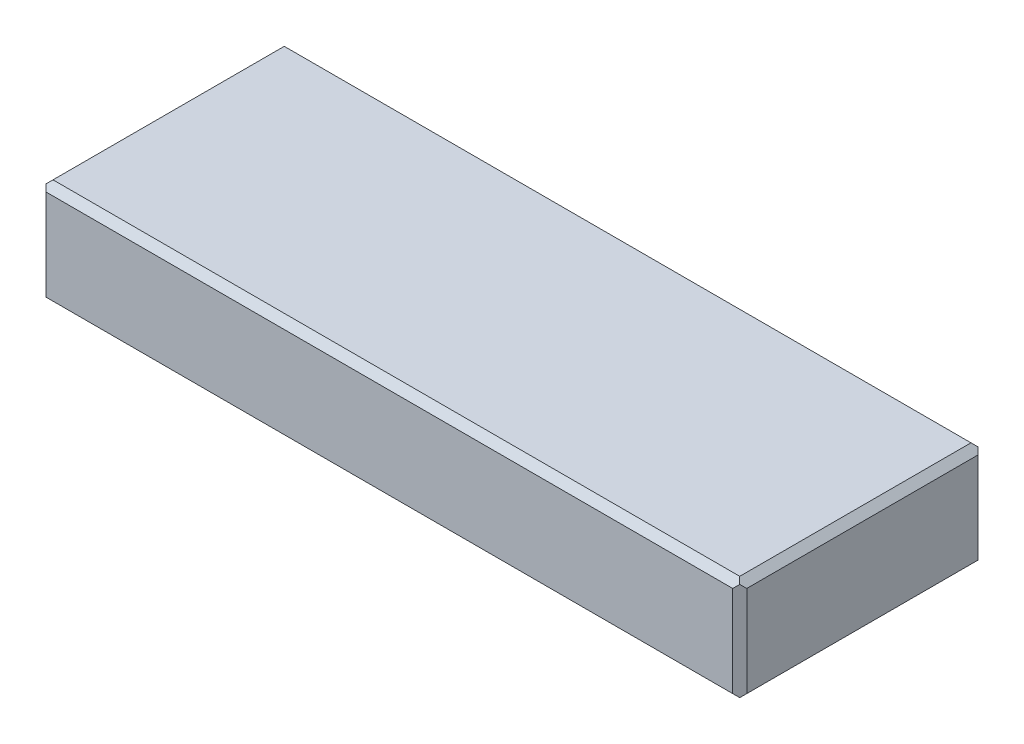
ISO-10303-21;
HEADER;
FILE_DESCRIPTION(('STEP AP214'),'2;1');
FILE_NAME('part.step','',(''),(''),'','','');
FILE_SCHEMA(('AUTOMOTIVE_DESIGN { 1 0 10303 214 1 1 1 1 }'));
ENDSEC;
DATA;
#1=APPLICATION_CONTEXT('core data for automotive mechanical design processes');
#2=APPLICATION_PROTOCOL_DEFINITION('international standard','automotive_design',2000,#1);
#3=PRODUCT_CONTEXT('',#1,'mechanical');
#4=PRODUCT('Part','Part','',(#3));
#5=PRODUCT_RELATED_PRODUCT_CATEGORY('part','',(#4));
#6=PRODUCT_DEFINITION_FORMATION('','',#4);
#7=PRODUCT_DEFINITION_CONTEXT('part definition',#1,'design');
#8=PRODUCT_DEFINITION('design','',#6,#7);
#9=PRODUCT_DEFINITION_SHAPE('','',#8);
#10=(LENGTH_UNIT() NAMED_UNIT(*) SI_UNIT(.MILLI.,.METRE.));
#11=(NAMED_UNIT(*) PLANE_ANGLE_UNIT() SI_UNIT($,.RADIAN.));
#12=(NAMED_UNIT(*) SI_UNIT($,.STERADIAN.) SOLID_ANGLE_UNIT());
#13=UNCERTAINTY_MEASURE_WITH_UNIT(LENGTH_MEASURE(1.E-05),#10,'distance_accuracy_value','');
#14=(GEOMETRIC_REPRESENTATION_CONTEXT(3) GLOBAL_UNCERTAINTY_ASSIGNED_CONTEXT((#13)) GLOBAL_UNIT_ASSIGNED_CONTEXT((#10,
#11,#12)) REPRESENTATION_CONTEXT('',''));
#15=CARTESIAN_POINT('',(0.,0.,0.));
#16=DIRECTION('',(0.,0.,1.));
#17=DIRECTION('',(1.,0.,0.));
#18=AXIS2_PLACEMENT_3D('',#15,#16,#17);
#19=CARTESIAN_POINT('',(-49.1218653149621,29.1510548523207,70.));
#20=DIRECTION('',(1.,0.,0.));
#21=DIRECTION('',(0.,1.,0.));
#22=AXIS2_PLACEMENT_3D('',#19,#20,#21);
#23=PLANE('',#22);
#24=DIRECTION('',(0.,0.,1.));
#25=VECTOR('',#24,1.);
#26=CARTESIAN_POINT('',(-49.1218653149621,1.15105485232071,70.));
#27=LINE('',#26,#25);
#28=CARTESIAN_POINT('',(-49.1218653149621,1.15105485232071,2.00000000000003));
#29=VERTEX_POINT('',#28);
#30=CARTESIAN_POINT('',(-49.1218653149621,1.15105485232071,68.));
#31=VERTEX_POINT('',#30);
#32=EDGE_CURVE('E172',#29,#31,#27,.T.);
#33=ORIENTED_EDGE('',*,*,#32,.T.);
#34=DIRECTION('',(0.,1.,0.));
#35=VECTOR('',#34,1.);
#36=CARTESIAN_POINT('',(-49.1218653149621,27.1510548523207,68.));
#37=LINE('',#36,#35);
#38=CARTESIAN_POINT('',(-49.1218653149621,27.1510548523207,68.));
#39=VERTEX_POINT('',#38);
#40=EDGE_CURVE('E235',#31,#39,#37,.T.);
#41=ORIENTED_EDGE('',*,*,#40,.T.);
#42=DIRECTION('',(0.,0.,-1.));
#43=VECTOR('',#42,1.);
#44=CARTESIAN_POINT('',(-49.1218653149621,27.1510548523207,70.));
#45=LINE('',#44,#43);
#46=CARTESIAN_POINT('',(-49.1218653149621,27.1510548523207,2.));
#47=VERTEX_POINT('',#46);
#48=EDGE_CURVE('E183',#39,#47,#45,.T.);
#49=ORIENTED_EDGE('',*,*,#48,.T.);
#50=DIRECTION('',(0.,-1.,0.));
#51=VECTOR('',#50,1.);
#52=CARTESIAN_POINT('',(-49.1218653149621,29.1510548523207,2.));
#53=LINE('',#52,#51);
#54=EDGE_CURVE('E232',#47,#29,#53,.T.);
#55=ORIENTED_EDGE('',*,*,#54,.T.);
#56=EDGE_LOOP('',(#33,#41,#49,#55));
#57=FACE_BOUND('',#56,.T.);
#58=ADVANCED_FACE('F31',(#57),#23,.F.);
#59=CARTESIAN_POINT('',(-49.1218653149621,-0.848945147679317,70.));
#60=DIRECTION('',(0.,1.,0.));
#61=DIRECTION('',(0.,0.,1.));
#62=AXIS2_PLACEMENT_3D('',#59,#60,#61);
#63=PLANE('',#62);
#64=DIRECTION('',(-1.,0.,0.));
#65=VECTOR('',#64,1.);
#66=CARTESIAN_POINT('',(-49.1218653149621,-0.848945147679317,68.));
#67=LINE('',#66,#65);
#68=CARTESIAN_POINT('',(148.878134685038,-0.848945147679317,68.));
#69=VERTEX_POINT('',#68);
#70=CARTESIAN_POINT('',(-47.1218653149621,-0.848945147679317,68.));
#71=VERTEX_POINT('',#70);
#72=EDGE_CURVE('E161',#69,#71,#67,.T.);
#73=ORIENTED_EDGE('',*,*,#72,.T.);
#74=DIRECTION('',(0.,0.,-1.));
#75=VECTOR('',#74,1.);
#76=CARTESIAN_POINT('',(-47.1218653149621,-0.848945147679317,70.));
#77=LINE('',#76,#75);
#78=CARTESIAN_POINT('',(-47.1218653149621,-0.848945147679317,2.00000000000003));
#79=VERTEX_POINT('',#78);
#80=EDGE_CURVE('E160',#71,#79,#77,.T.);
#81=ORIENTED_EDGE('',*,*,#80,.T.);
#82=DIRECTION('',(1.,0.,0.));
#83=VECTOR('',#82,1.);
#84=CARTESIAN_POINT('',(-49.1218653149621,-0.848945147679317,2.00000000000003));
#85=LINE('',#84,#83);
#86=CARTESIAN_POINT('',(148.878134685038,-0.848945147679317,2.00000000000003));
#87=VERTEX_POINT('',#86);
#88=EDGE_CURVE('E146',#79,#87,#85,.T.);
#89=ORIENTED_EDGE('',*,*,#88,.T.);
#90=DIRECTION('',(0.,0.,1.));
#91=VECTOR('',#90,1.);
#92=CARTESIAN_POINT('',(148.878134685038,-0.848945147679317,70.));
#93=LINE('',#92,#91);
#94=EDGE_CURVE('E157',#87,#69,#93,.T.);
#95=ORIENTED_EDGE('',*,*,#94,.T.);
#96=EDGE_LOOP('',(#73,#81,#89,#95));
#97=FACE_BOUND('',#96,.T.);
#98=ADVANCED_FACE('F156',(#97),#63,.F.);
#99=CARTESIAN_POINT('',(150.878134685038,29.1510548523207,70.));
#100=DIRECTION('',(-1.,0.,0.));
#101=DIRECTION('',(0.,0.,1.));
#102=AXIS2_PLACEMENT_3D('',#99,#100,#101);
#103=PLANE('',#102);
#104=DIRECTION('',(0.,0.,1.));
#105=VECTOR('',#104,1.);
#106=CARTESIAN_POINT('',(150.878134685038,27.1510548523207,70.));
#107=LINE('',#106,#105);
#108=CARTESIAN_POINT('',(150.878134685038,27.1510548523207,1.99999999999999));
#109=VERTEX_POINT('',#108);
#110=CARTESIAN_POINT('',(150.878134685038,27.1510548523207,68.));
#111=VERTEX_POINT('',#110);
#112=EDGE_CURVE('E204',#109,#111,#107,.T.);
#113=ORIENTED_EDGE('',*,*,#112,.T.);
#114=DIRECTION('',(0.,-1.,0.));
#115=VECTOR('',#114,1.);
#116=CARTESIAN_POINT('',(150.878134685038,1.15105485232071,68.));
#117=LINE('',#116,#115);
#118=CARTESIAN_POINT('',(150.878134685038,1.15105485232072,68.));
#119=VERTEX_POINT('',#118);
#120=EDGE_CURVE('E252',#111,#119,#117,.T.);
#121=ORIENTED_EDGE('',*,*,#120,.T.);
#122=DIRECTION('',(0.,0.,-1.));
#123=VECTOR('',#122,1.);
#124=CARTESIAN_POINT('',(150.878134685038,1.15105485232071,70.));
#125=LINE('',#124,#123);
#126=CARTESIAN_POINT('',(150.878134685038,1.15105485232071,2.));
#127=VERTEX_POINT('',#126);
#128=EDGE_CURVE('E180',#119,#127,#125,.T.);
#129=ORIENTED_EDGE('',*,*,#128,.T.);
#130=DIRECTION('',(0.,1.,0.));
#131=VECTOR('',#130,1.);
#132=CARTESIAN_POINT('',(150.878134685038,29.1510548523207,2.));
#133=LINE('',#132,#131);
#134=EDGE_CURVE('E249',#127,#109,#133,.T.);
#135=ORIENTED_EDGE('',*,*,#134,.T.);
#136=EDGE_LOOP('',(#113,#121,#129,#135));
#137=FACE_BOUND('',#136,.T.);
#138=ADVANCED_FACE('F305',(#137),#103,.F.);
#139=CARTESIAN_POINT('',(-49.1218653149621,29.1510548523207,70.));
#140=DIRECTION('',(0.,-1.,0.));
#141=DIRECTION('',(0.,0.,-1.));
#142=AXIS2_PLACEMENT_3D('',#139,#140,#141);
#143=PLANE('',#142);
#144=DIRECTION('',(-1.,0.,0.));
#145=VECTOR('',#144,1.);
#146=CARTESIAN_POINT('',(-49.1218653149621,29.1510548523207,2.));
#147=LINE('',#146,#145);
#148=CARTESIAN_POINT('',(148.878134685038,29.1510548523207,2.));
#149=VERTEX_POINT('',#148);
#150=CARTESIAN_POINT('',(-47.1218653149621,29.1510548523207,2.));
#151=VERTEX_POINT('',#150);
#152=EDGE_CURVE('E191',#149,#151,#147,.T.);
#153=ORIENTED_EDGE('',*,*,#152,.T.);
#154=DIRECTION('',(0.,0.,1.));
#155=VECTOR('',#154,1.);
#156=CARTESIAN_POINT('',(-47.1218653149621,29.1510548523207,70.));
#157=LINE('',#156,#155);
#158=CARTESIAN_POINT('',(-47.1218653149621,29.1510548523207,68.));
#159=VERTEX_POINT('',#158);
#160=EDGE_CURVE('E198',#151,#159,#157,.T.);
#161=ORIENTED_EDGE('',*,*,#160,.T.);
#162=DIRECTION('',(1.,0.,0.));
#163=VECTOR('',#162,1.);
#164=CARTESIAN_POINT('',(150.878134685038,29.1510548523207,68.));
#165=LINE('',#164,#163);
#166=CARTESIAN_POINT('',(148.878134685038,29.1510548523207,68.));
#167=VERTEX_POINT('',#166);
#168=EDGE_CURVE('E195',#159,#167,#165,.T.);
#169=ORIENTED_EDGE('',*,*,#168,.T.);
#170=DIRECTION('',(0.,0.,-1.));
#171=VECTOR('',#170,1.);
#172=CARTESIAN_POINT('',(148.878134685038,29.1510548523207,70.));
#173=LINE('',#172,#171);
#174=EDGE_CURVE('E193',#167,#149,#173,.T.);
#175=ORIENTED_EDGE('',*,*,#174,.T.);
#176=EDGE_LOOP('',(#153,#161,#169,#175));
#177=FACE_BOUND('',#176,.T.);
#178=ADVANCED_FACE('F296',(#177),#143,.F.);
#179=CARTESIAN_POINT('',(-49.1218653149621,-0.848945147679317,70.));
#180=DIRECTION('',(0.,0.,1.));
#181=DIRECTION('',(1.,0.,0.));
#182=AXIS2_PLACEMENT_3D('',#179,#180,#181);
#183=PLANE('',#182);
#184=DIRECTION('',(-1.,0.,0.));
#185=VECTOR('',#184,1.);
#186=CARTESIAN_POINT('',(-49.1218653149621,27.1510548523207,70.));
#187=LINE('',#186,#185);
#188=CARTESIAN_POINT('',(148.878134685038,27.1510548523207,70.));
#189=VERTEX_POINT('',#188);
#190=CARTESIAN_POINT('',(-47.1218653149621,27.1510548523207,70.));
#191=VERTEX_POINT('',#190);
#192=EDGE_CURVE('E201',#189,#191,#187,.T.);
#193=ORIENTED_EDGE('',*,*,#192,.T.);
#194=DIRECTION('',(0.,-1.,0.));
#195=VECTOR('',#194,1.);
#196=CARTESIAN_POINT('',(-47.1218653149621,1.15105485232071,70.));
#197=LINE('',#196,#195);
#198=CARTESIAN_POINT('',(-47.1218653149621,1.15105485232072,70.));
#199=VERTEX_POINT('',#198);
#200=EDGE_CURVE('E221',#191,#199,#197,.T.);
#201=ORIENTED_EDGE('',*,*,#200,.T.);
#202=DIRECTION('',(1.,0.,0.));
#203=VECTOR('',#202,1.);
#204=CARTESIAN_POINT('',(150.878134685038,1.15105485232071,70.));
#205=LINE('',#204,#203);
#206=CARTESIAN_POINT('',(148.878134685038,1.15105485232073,70.));
#207=VERTEX_POINT('',#206);
#208=EDGE_CURVE('E177',#199,#207,#205,.T.);
#209=ORIENTED_EDGE('',*,*,#208,.T.);
#210=DIRECTION('',(0.,1.,0.));
#211=VECTOR('',#210,1.);
#212=CARTESIAN_POINT('',(148.878134685038,27.1510548523207,70.));
#213=LINE('',#212,#211);
#214=EDGE_CURVE('E209',#207,#189,#213,.T.);
#215=ORIENTED_EDGE('',*,*,#214,.T.);
#216=EDGE_LOOP('',(#193,#201,#209,#215));
#217=FACE_BOUND('',#216,.T.);
#218=ADVANCED_FACE('F339',(#217),#183,.T.);
#219=CARTESIAN_POINT('',(-49.1218653149621,-0.848945147679317,0.));
#220=DIRECTION('',(0.,0.,1.));
#221=DIRECTION('',(1.,0.,0.));
#222=AXIS2_PLACEMENT_3D('',#219,#220,#221);
#223=PLANE('',#222);
#224=DIRECTION('',(1.,0.,0.));
#225=VECTOR('',#224,1.);
#226=CARTESIAN_POINT('',(-49.1218653149621,27.1510548523207,0.));
#227=LINE('',#226,#225);
#228=CARTESIAN_POINT('',(-47.1218653149621,27.1510548523207,0.));
#229=VERTEX_POINT('',#228);
#230=CARTESIAN_POINT('',(148.878134685038,27.1510548523207,0.));
#231=VERTEX_POINT('',#230);
#232=EDGE_CURVE('E207',#229,#231,#227,.T.);
#233=ORIENTED_EDGE('',*,*,#232,.T.);
#234=DIRECTION('',(0.,-1.,0.));
#235=VECTOR('',#234,1.);
#236=CARTESIAN_POINT('',(148.878134685038,-0.848945147679317,0.));
#237=LINE('',#236,#235);
#238=CARTESIAN_POINT('',(148.878134685038,1.15105485232071,0.));
#239=VERTEX_POINT('',#238);
#240=EDGE_CURVE('E52',#231,#239,#237,.T.);
#241=ORIENTED_EDGE('',*,*,#240,.T.);
#242=DIRECTION('',(-1.,0.,0.));
#243=VECTOR('',#242,1.);
#244=CARTESIAN_POINT('',(-49.1218653149621,1.15105485232071,0.));
#245=LINE('',#244,#243);
#246=CARTESIAN_POINT('',(-47.1218653149621,1.15105485232071,0.));
#247=VERTEX_POINT('',#246);
#248=EDGE_CURVE('E175',#239,#247,#245,.T.);
#249=ORIENTED_EDGE('',*,*,#248,.T.);
#250=DIRECTION('',(0.,1.,0.));
#251=VECTOR('',#250,1.);
#252=CARTESIAN_POINT('',(-47.1218653149621,-0.848945147679317,0.));
#253=LINE('',#252,#251);
#254=EDGE_CURVE('E262',#247,#229,#253,.T.);
#255=ORIENTED_EDGE('',*,*,#254,.T.);
#256=EDGE_LOOP('',(#233,#241,#249,#255));
#257=FACE_BOUND('',#256,.T.);
#258=ADVANCED_FACE('F266',(#257),#223,.F.);
#259=CARTESIAN_POINT('',(150.878134685038,1.15105485232071,70.));
#260=DIRECTION('',(-0.707106781186547,0.707106781186547,0.));
#261=DIRECTION('',(-0.707106781186548,-0.707106781186548,0.));
#262=AXIS2_PLACEMENT_3D('',#259,#260,#261);
#263=PLANE('',#262);
#264=ORIENTED_EDGE('',*,*,#128,.F.);
#265=DIRECTION('',(0.577350269189626,0.577350269189626,-0.577350269189626));
#266=VECTOR('',#265,1.);
#267=CARTESIAN_POINT('',(150.211468018371,0.484388185654045,68.6666666666667));
#268=LINE('',#267,#266);
#269=CARTESIAN_POINT('',(149.878134685038,0.151054852320743,69.));
#270=VERTEX_POINT('',#269);
#271=EDGE_CURVE('E256',#119,#270,#268,.F.);
#272=ORIENTED_EDGE('',*,*,#271,.T.);
#273=DIRECTION('',(0.577350269189626,0.577350269189626,0.577350269189626));
#274=VECTOR('',#273,1.);
#275=CARTESIAN_POINT('',(150.878134685038,1.15105485232071,70.));
#276=LINE('',#275,#274);
#277=EDGE_CURVE('E152',#69,#270,#276,.T.);
#278=ORIENTED_EDGE('',*,*,#277,.F.);
#279=ORIENTED_EDGE('',*,*,#94,.F.);
#280=DIRECTION('',(0.577350269189626,0.577350269189626,-0.577350269189626));
#281=VECTOR('',#280,1.);
#282=CARTESIAN_POINT('',(127.544801351705,-22.1822784810126,23.3333333333333));
#283=LINE('',#282,#281);
#284=CARTESIAN_POINT('',(149.878134685038,0.151054852320713,0.999999999999996));
#285=VERTEX_POINT('',#284);
#286=EDGE_CURVE('E143',#285,#87,#283,.F.);
#287=ORIENTED_EDGE('',*,*,#286,.F.);
#288=DIRECTION('',(0.577350269189626,0.577350269189626,0.577350269189626));
#289=VECTOR('',#288,1.);
#290=CARTESIAN_POINT('',(173.544801351705,23.8177215189874,24.6666666666667));
#291=LINE('',#290,#289);
#292=EDGE_CURVE('E254',#285,#127,#291,.T.);
#293=ORIENTED_EDGE('',*,*,#292,.T.);
#294=EDGE_LOOP('',(#264,#272,#278,#279,#287,#293));
#295=FACE_BOUND('',#294,.T.);
#296=ADVANCED_FACE('F164',(#295),#263,.F.);
#297=CARTESIAN_POINT('',(-49.1218653149621,1.15105485232071,70.));
#298=DIRECTION('',(0.,-0.707106781186547,0.707106781186547));
#299=DIRECTION('',(0.,-0.707106781186548,-0.707106781186548));
#300=AXIS2_PLACEMENT_3D('',#297,#298,#299);
#301=PLANE('',#300);
#302=ORIENTED_EDGE('',*,*,#208,.F.);
#303=DIRECTION('',(-0.577350269189626,-0.577350269189626,-0.577350269189626));
#304=VECTOR('',#303,1.);
#305=CARTESIAN_POINT('',(-47.7885319816288,0.484388185654046,69.3333333333333));
#306=LINE('',#305,#304);
#307=CARTESIAN_POINT('',(-48.1218653149621,0.15105485232071,69.));
#308=VERTEX_POINT('',#307);
#309=EDGE_CURVE('E226',#199,#308,#306,.T.);
#310=ORIENTED_EDGE('',*,*,#309,.T.);
#311=DIRECTION('',(-0.577350269189626,0.577350269189626,0.577350269189626));
#312=VECTOR('',#311,1.);
#313=CARTESIAN_POINT('',(-49.1218653149621,1.15105485232071,70.));
#314=LINE('',#313,#312);
#315=EDGE_CURVE('E153',#71,#308,#314,.T.);
#316=ORIENTED_EDGE('',*,*,#315,.F.);
#317=ORIENTED_EDGE('',*,*,#72,.F.);
#318=ORIENTED_EDGE('',*,*,#277,.T.);
#319=DIRECTION('',(-0.577350269189626,0.577350269189626,0.577350269189626));
#320=VECTOR('',#319,1.);
#321=CARTESIAN_POINT('',(82.8781346850379,67.1510548523207,136.));
#322=LINE('',#321,#320);
#323=EDGE_CURVE('E224',#270,#207,#322,.T.);
#324=ORIENTED_EDGE('',*,*,#323,.T.);
#325=EDGE_LOOP('',(#302,#310,#316,#317,#318,#324));
#326=FACE_BOUND('',#325,.T.);
#327=ADVANCED_FACE('F315',(#326),#301,.T.);
#328=CARTESIAN_POINT('',(-49.1218653149621,-0.848945147679317,2.00000000000003));
#329=DIRECTION('',(0.,0.707106781186547,0.707106781186547));
#330=DIRECTION('',(0.,-0.707106781186548,0.707106781186548));
#331=AXIS2_PLACEMENT_3D('',#328,#329,#330);
#332=PLANE('',#331);
#333=ORIENTED_EDGE('',*,*,#248,.F.);
#334=DIRECTION('',(0.577350269189626,-0.577350269189626,0.577350269189626));
#335=VECTOR('',#334,1.);
#336=CARTESIAN_POINT('',(84.2114680183713,65.8177215189874,-64.6666666666667));
#337=LINE('',#336,#335);
#338=EDGE_CURVE('E11',#239,#285,#337,.T.);
#339=ORIENTED_EDGE('',*,*,#338,.T.);
#340=ORIENTED_EDGE('',*,*,#286,.T.);
#341=ORIENTED_EDGE('',*,*,#88,.F.);
#342=DIRECTION('',(-0.577350269189626,0.577350269189626,-0.577350269189626));
#343=VECTOR('',#342,1.);
#344=CARTESIAN_POINT('',(-47.7885319816287,-0.18227848101264,1.33333333333335));
#345=LINE('',#344,#343);
#346=CARTESIAN_POINT('',(-48.1218653149621,0.151054852320713,1.));
#347=VERTEX_POINT('',#346);
#348=EDGE_CURVE('E184',#347,#79,#345,.F.);
#349=ORIENTED_EDGE('',*,*,#348,.F.);
#350=DIRECTION('',(0.577350269189626,0.577350269189626,-0.577350269189626));
#351=VECTOR('',#350,1.);
#352=CARTESIAN_POINT('',(-49.1218653149621,-0.848945147679308,2.00000000000002));
#353=LINE('',#352,#351);
#354=EDGE_CURVE('E39',#347,#247,#353,.T.);
#355=ORIENTED_EDGE('',*,*,#354,.T.);
#356=EDGE_LOOP('',(#333,#339,#340,#341,#349,#355));
#357=FACE_BOUND('',#356,.T.);
#358=ADVANCED_FACE('F145',(#357),#332,.F.);
#359=CARTESIAN_POINT('',(-47.1218653149621,-0.848945147679317,70.));
#360=DIRECTION('',(0.707106781186547,0.707106781186547,0.));
#361=DIRECTION('',(-0.707106781186548,0.707106781186548,0.));
#362=AXIS2_PLACEMENT_3D('',#359,#360,#361);
#363=PLANE('',#362);
#364=ORIENTED_EDGE('',*,*,#315,.T.);
#365=DIRECTION('',(0.577350269189626,-0.577350269189626,0.577350269189626));
#366=VECTOR('',#365,1.);
#367=CARTESIAN_POINT('',(-47.1218653149621,-0.848945147679308,70.));
#368=LINE('',#367,#366);
#369=EDGE_CURVE('E230',#308,#31,#368,.F.);
#370=ORIENTED_EDGE('',*,*,#369,.T.);
#371=ORIENTED_EDGE('',*,*,#32,.F.);
#372=DIRECTION('',(0.577350269189626,-0.577350269189626,-0.577350269189626));
#373=VECTOR('',#372,1.);
#374=CARTESIAN_POINT('',(-70.4551986482954,22.484388185654,23.3333333333333));
#375=LINE('',#374,#373);
#376=EDGE_CURVE('E228',#29,#347,#375,.T.);
#377=ORIENTED_EDGE('',*,*,#376,.T.);
#378=ORIENTED_EDGE('',*,*,#348,.T.);
#379=ORIENTED_EDGE('',*,*,#80,.F.);
#380=EDGE_LOOP('',(#364,#370,#371,#377,#378,#379));
#381=FACE_BOUND('',#380,.T.);
#382=ADVANCED_FACE('F318',(#381),#363,.F.);
#383=CARTESIAN_POINT('',(148.878134685038,29.1510548523207,70.));
#384=DIRECTION('',(-0.707106781186547,-0.707106781186547,0.));
#385=DIRECTION('',(0.707106781186548,-0.707106781186548,0.));
#386=AXIS2_PLACEMENT_3D('',#383,#384,#385);
#387=PLANE('',#386);
#388=DIRECTION('',(-0.577350269189626,0.577350269189626,-0.577350269189626));
#389=VECTOR('',#388,1.);
#390=CARTESIAN_POINT('',(149.544801351705,28.484388185654,68.6666666666667));
#391=LINE('',#390,#389);
#392=CARTESIAN_POINT('',(149.878134685038,28.1510548523207,69.));
#393=VERTEX_POINT('',#392);
#394=EDGE_CURVE('E186',#393,#167,#391,.T.);
#395=ORIENTED_EDGE('',*,*,#394,.F.);
#396=DIRECTION('',(-0.577350269189626,0.577350269189626,0.577350269189626));
#397=VECTOR('',#396,1.);
#398=CARTESIAN_POINT('',(148.878134685038,29.1510548523207,70.));
#399=LINE('',#398,#397);
#400=EDGE_CURVE('E247',#393,#111,#399,.F.);
#401=ORIENTED_EDGE('',*,*,#400,.T.);
#402=ORIENTED_EDGE('',*,*,#112,.F.);
#403=DIRECTION('',(-0.577350269189626,0.577350269189626,-0.577350269189626));
#404=VECTOR('',#403,1.);
#405=CARTESIAN_POINT('',(172.211468018371,5.81772151898734,23.3333333333333));
#406=LINE('',#405,#404);
#407=CARTESIAN_POINT('',(149.878134685038,28.1510548523207,1.00000000000001));
#408=VERTEX_POINT('',#407);
#409=EDGE_CURVE('E245',#109,#408,#406,.T.);
#410=ORIENTED_EDGE('',*,*,#409,.T.);
#411=DIRECTION('',(0.577350269189626,-0.577350269189626,-0.577350269189626));
#412=VECTOR('',#411,1.);
#413=CARTESIAN_POINT('',(82.8781346850379,95.1510548523207,68.));
#414=LINE('',#413,#412);
#415=EDGE_CURVE('E215',#149,#408,#414,.T.);
#416=ORIENTED_EDGE('',*,*,#415,.F.);
#417=ORIENTED_EDGE('',*,*,#174,.F.);
#418=EDGE_LOOP('',(#395,#401,#402,#410,#416,#417));
#419=FACE_BOUND('',#418,.T.);
#420=ADVANCED_FACE('F320',(#419),#387,.F.);
#421=CARTESIAN_POINT('',(-49.1218653149621,27.1510548523207,70.));
#422=DIRECTION('',(0.,0.707106781186547,0.707106781186547));
#423=DIRECTION('',(0.,-0.707106781186548,0.707106781186548));
#424=AXIS2_PLACEMENT_3D('',#421,#422,#423);
#425=PLANE('',#424);
#426=DIRECTION('',(0.577350269189626,0.577350269189626,-0.577350269189626));
#427=VECTOR('',#426,1.);
#428=CARTESIAN_POINT('',(-49.1218653149621,27.1510548523207,70.));
#429=LINE('',#428,#427);
#430=CARTESIAN_POINT('',(-48.1218653149621,28.1510548523207,69.));
#431=VERTEX_POINT('',#430);
#432=EDGE_CURVE('E213',#431,#159,#429,.T.);
#433=ORIENTED_EDGE('',*,*,#432,.F.);
#434=DIRECTION('',(0.577350269189626,-0.577350269189626,0.577350269189626));
#435=VECTOR('',#434,1.);
#436=CARTESIAN_POINT('',(-47.7885319816288,27.8177215189873,69.3333333333333));
#437=LINE('',#436,#435);
#438=EDGE_CURVE('E243',#431,#191,#437,.T.);
#439=ORIENTED_EDGE('',*,*,#438,.T.);
#440=ORIENTED_EDGE('',*,*,#192,.F.);
#441=DIRECTION('',(0.577350269189626,0.577350269189626,-0.577350269189626));
#442=VECTOR('',#441,1.);
#443=CARTESIAN_POINT('',(82.8781346850379,-38.8489451476793,136.));
#444=LINE('',#443,#442);
#445=EDGE_CURVE('E241',#189,#393,#444,.T.);
#446=ORIENTED_EDGE('',*,*,#445,.T.);
#447=ORIENTED_EDGE('',*,*,#394,.T.);
#448=ORIENTED_EDGE('',*,*,#168,.F.);
#449=EDGE_LOOP('',(#433,#439,#440,#446,#447,#448));
#450=FACE_BOUND('',#449,.T.);
#451=ADVANCED_FACE('F291',(#450),#425,.T.);
#452=CARTESIAN_POINT('',(-49.1218653149621,29.1510548523207,2.));
#453=DIRECTION('',(0.,-0.707106781186547,0.707106781186547));
#454=DIRECTION('',(0.,-0.707106781186548,-0.707106781186548));
#455=AXIS2_PLACEMENT_3D('',#452,#453,#454);
#456=PLANE('',#455);
#457=ORIENTED_EDGE('',*,*,#415,.T.);
#458=DIRECTION('',(-0.577350269189626,-0.577350269189626,-0.577350269189626));
#459=VECTOR('',#458,1.);
#460=CARTESIAN_POINT('',(84.2114680183713,-37.515611814346,-64.6666666666667));
#461=LINE('',#460,#459);
#462=EDGE_CURVE('E260',#408,#231,#461,.T.);
#463=ORIENTED_EDGE('',*,*,#462,.T.);
#464=ORIENTED_EDGE('',*,*,#232,.F.);
#465=DIRECTION('',(-0.577350269189626,0.577350269189626,0.577350269189626));
#466=VECTOR('',#465,1.);
#467=CARTESIAN_POINT('',(-49.1218653149621,29.1510548523207,2.));
#468=LINE('',#467,#466);
#469=CARTESIAN_POINT('',(-48.1218653149621,28.1510548523207,1.));
#470=VERTEX_POINT('',#469);
#471=EDGE_CURVE('E258',#229,#470,#468,.T.);
#472=ORIENTED_EDGE('',*,*,#471,.T.);
#473=DIRECTION('',(0.577350269189626,0.577350269189626,0.577350269189626));
#474=VECTOR('',#473,1.);
#475=CARTESIAN_POINT('',(-47.7885319816288,28.484388185654,1.33333333333333));
#476=LINE('',#475,#474);
#477=EDGE_CURVE('E210',#151,#470,#476,.F.);
#478=ORIENTED_EDGE('',*,*,#477,.F.);
#479=ORIENTED_EDGE('',*,*,#152,.F.);
#480=EDGE_LOOP('',(#457,#463,#464,#472,#478,#479));
#481=FACE_BOUND('',#480,.T.);
#482=ADVANCED_FACE('F270',(#481),#456,.F.);
#483=CARTESIAN_POINT('',(-49.1218653149621,27.1510548523207,70.));
#484=DIRECTION('',(0.707106781186547,-0.707106781186547,0.));
#485=DIRECTION('',(0.707106781186548,0.707106781186548,0.));
#486=AXIS2_PLACEMENT_3D('',#483,#484,#485);
#487=PLANE('',#486);
#488=ORIENTED_EDGE('',*,*,#48,.F.);
#489=DIRECTION('',(-0.577350269189626,-0.577350269189626,-0.577350269189626));
#490=VECTOR('',#489,1.);
#491=CARTESIAN_POINT('',(-48.4551986482954,27.8177215189873,68.6666666666667));
#492=LINE('',#491,#490);
#493=EDGE_CURVE('E239',#39,#431,#492,.F.);
#494=ORIENTED_EDGE('',*,*,#493,.T.);
#495=ORIENTED_EDGE('',*,*,#432,.T.);
#496=ORIENTED_EDGE('',*,*,#160,.F.);
#497=ORIENTED_EDGE('',*,*,#477,.T.);
#498=DIRECTION('',(-0.577350269189626,-0.577350269189626,0.577350269189626));
#499=VECTOR('',#498,1.);
#500=CARTESIAN_POINT('',(-71.7885319816288,4.48438818565401,24.6666666666667));
#501=LINE('',#500,#499);
#502=EDGE_CURVE('E237',#470,#47,#501,.T.);
#503=ORIENTED_EDGE('',*,*,#502,.T.);
#504=EDGE_LOOP('',(#488,#494,#495,#496,#497,#503));
#505=FACE_BOUND('',#504,.T.);
#506=ADVANCED_FACE('F277',(#505),#487,.F.);
#507=CARTESIAN_POINT('',(-47.1218653149621,-0.848945147679317,70.));
#508=DIRECTION('',(-0.707106781186547,0.,0.707106781186547));
#509=DIRECTION('',(0.707106781186548,0.,0.707106781186548));
#510=AXIS2_PLACEMENT_3D('',#507,#508,#509);
#511=PLANE('',#510);
#512=ORIENTED_EDGE('',*,*,#493,.F.);
#513=ORIENTED_EDGE('',*,*,#40,.F.);
#514=ORIENTED_EDGE('',*,*,#369,.F.);
#515=ORIENTED_EDGE('',*,*,#309,.F.);
#516=ORIENTED_EDGE('',*,*,#200,.F.);
#517=ORIENTED_EDGE('',*,*,#438,.F.);
#518=EDGE_LOOP('',(#512,#513,#514,#515,#516,#517));
#519=FACE_BOUND('',#518,.T.);
#520=ADVANCED_FACE('F285',(#519),#511,.T.);
#521=CARTESIAN_POINT('',(148.878134685038,-0.848945147679317,70.));
#522=DIRECTION('',(0.707106781186547,0.,0.707106781186547));
#523=DIRECTION('',(0.707106781186548,0.,-0.707106781186548));
#524=AXIS2_PLACEMENT_3D('',#521,#522,#523);
#525=PLANE('',#524);
#526=ORIENTED_EDGE('',*,*,#271,.F.);
#527=ORIENTED_EDGE('',*,*,#120,.F.);
#528=ORIENTED_EDGE('',*,*,#400,.F.);
#529=ORIENTED_EDGE('',*,*,#445,.F.);
#530=ORIENTED_EDGE('',*,*,#214,.F.);
#531=ORIENTED_EDGE('',*,*,#323,.F.);
#532=EDGE_LOOP('',(#526,#527,#528,#529,#530,#531));
#533=FACE_BOUND('',#532,.T.);
#534=ADVANCED_FACE('F310',(#533),#525,.T.);
#535=CARTESIAN_POINT('',(150.878134685038,29.1510548523207,2.));
#536=DIRECTION('',(-0.707106781186547,0.,0.707106781186547));
#537=DIRECTION('',(0.707106781186548,0.,0.707106781186548));
#538=AXIS2_PLACEMENT_3D('',#535,#536,#537);
#539=PLANE('',#538);
#540=ORIENTED_EDGE('',*,*,#338,.F.);
#541=ORIENTED_EDGE('',*,*,#240,.F.);
#542=ORIENTED_EDGE('',*,*,#462,.F.);
#543=ORIENTED_EDGE('',*,*,#409,.F.);
#544=ORIENTED_EDGE('',*,*,#134,.F.);
#545=ORIENTED_EDGE('',*,*,#292,.F.);
#546=EDGE_LOOP('',(#540,#541,#542,#543,#544,#545));
#547=FACE_BOUND('',#546,.T.);
#548=ADVANCED_FACE('F301',(#547),#539,.F.);
#549=CARTESIAN_POINT('',(-49.1218653149621,29.1510548523207,2.));
#550=DIRECTION('',(0.707106781186547,0.,0.707106781186547));
#551=DIRECTION('',(0.707106781186548,0.,-0.707106781186548));
#552=AXIS2_PLACEMENT_3D('',#549,#550,#551);
#553=PLANE('',#552);
#554=ORIENTED_EDGE('',*,*,#471,.F.);
#555=ORIENTED_EDGE('',*,*,#254,.F.);
#556=ORIENTED_EDGE('',*,*,#354,.F.);
#557=ORIENTED_EDGE('',*,*,#376,.F.);
#558=ORIENTED_EDGE('',*,*,#54,.F.);
#559=ORIENTED_EDGE('',*,*,#502,.F.);
#560=EDGE_LOOP('',(#554,#555,#556,#557,#558,#559));
#561=FACE_BOUND('',#560,.T.);
#562=ADVANCED_FACE('F33',(#561),#553,.F.);
#563=CLOSED_SHELL('',(#58,#98,#138,#178,#218,#258,#296,#327,#358,#382,#420,#451,#482,#506,#520,
#534,#548,#562));
#564=MANIFOLD_SOLID_BREP('B2',#563);
#565=ADVANCED_BREP_SHAPE_REPRESENTATION('',(#18,#564),#14);
#566=SHAPE_DEFINITION_REPRESENTATION(#9,#565);
ENDSEC;
END-ISO-10303-21;
